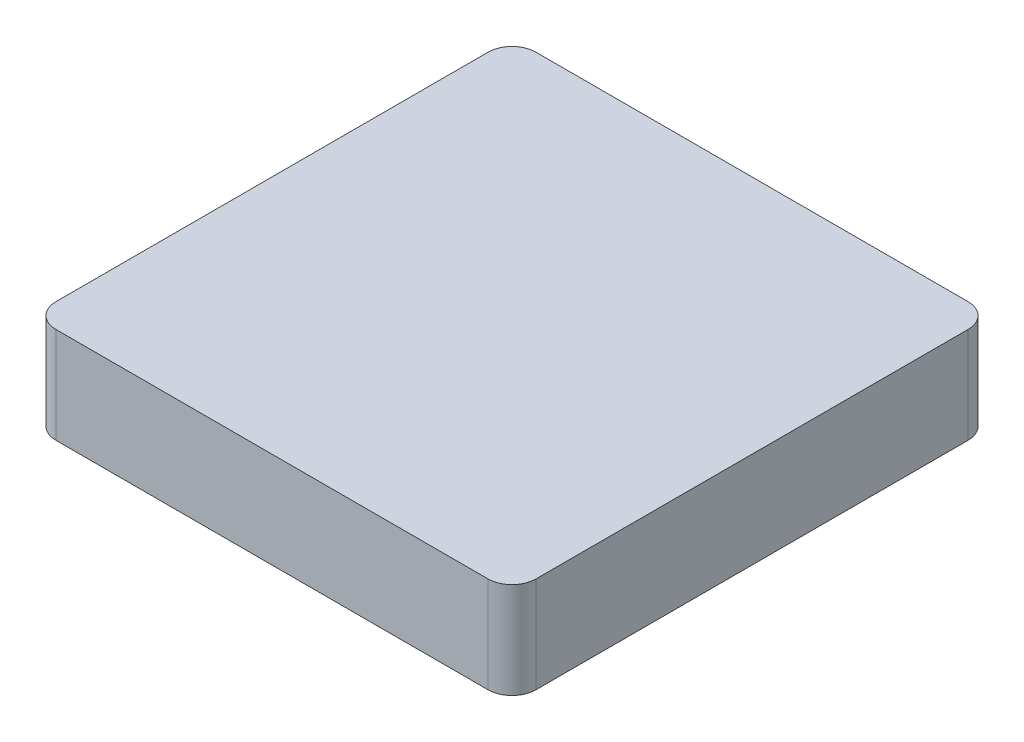
ISO-10303-21;
HEADER;
FILE_DESCRIPTION(('STEP AP214'),'2;1');
FILE_NAME('part.step','',(''),(''),'','','');
FILE_SCHEMA(('AUTOMOTIVE_DESIGN { 1 0 10303 214 1 1 1 1 }'));
ENDSEC;
DATA;
#1=APPLICATION_CONTEXT('core data for automotive mechanical design processes');
#2=APPLICATION_PROTOCOL_DEFINITION('international standard','automotive_design',2000,#1);
#3=PRODUCT_CONTEXT('',#1,'mechanical');
#4=PRODUCT('Part','Part','',(#3));
#5=PRODUCT_RELATED_PRODUCT_CATEGORY('part','',(#4));
#6=PRODUCT_DEFINITION_FORMATION('','',#4);
#7=PRODUCT_DEFINITION_CONTEXT('part definition',#1,'design');
#8=PRODUCT_DEFINITION('design','',#6,#7);
#9=PRODUCT_DEFINITION_SHAPE('','',#8);
#10=(LENGTH_UNIT() NAMED_UNIT(*) SI_UNIT(.MILLI.,.METRE.));
#11=(NAMED_UNIT(*) PLANE_ANGLE_UNIT() SI_UNIT($,.RADIAN.));
#12=(NAMED_UNIT(*) SI_UNIT($,.STERADIAN.) SOLID_ANGLE_UNIT());
#13=UNCERTAINTY_MEASURE_WITH_UNIT(LENGTH_MEASURE(1.E-05),#10,'distance_accuracy_value','');
#14=(GEOMETRIC_REPRESENTATION_CONTEXT(3) GLOBAL_UNCERTAINTY_ASSIGNED_CONTEXT((#13)) GLOBAL_UNIT_ASSIGNED_CONTEXT((#10,
#11,#12)) REPRESENTATION_CONTEXT('',''));
#15=CARTESIAN_POINT('',(0.,0.,0.));
#16=DIRECTION('',(0.,0.,1.));
#17=DIRECTION('',(1.,0.,0.));
#18=AXIS2_PLACEMENT_3D('',#15,#16,#17);
#19=CARTESIAN_POINT('',(0.,2.54,-12.7));
#20=DIRECTION('',(1.,0.,0.));
#21=DIRECTION('',(0.,0.,-1.));
#22=AXIS2_PLACEMENT_3D('',#19,#20,#21);
#23=PLANE('',#22);
#24=DIRECTION('',(0.,0.,1.));
#25=VECTOR('',#24,1.);
#26=CARTESIAN_POINT('',(0.,2.54,-12.7));
#27=LINE('',#26,#25);
#28=CARTESIAN_POINT('',(0.,2.54,-12.065));
#29=VERTEX_POINT('',#28);
#30=CARTESIAN_POINT('',(0.,2.54,-0.635));
#31=VERTEX_POINT('',#30);
#32=EDGE_CURVE('E173',#29,#31,#27,.T.);
#33=ORIENTED_EDGE('',*,*,#32,.F.);
#34=DIRECTION('',(0.,-1.,0.));
#35=VECTOR('',#34,1.);
#36=CARTESIAN_POINT('',(0.,2.54,-12.065));
#37=LINE('',#36,#35);
#38=CARTESIAN_POINT('',(0.,0.,-12.065));
#39=VERTEX_POINT('',#38);
#40=EDGE_CURVE('E198',#29,#39,#37,.T.);
#41=ORIENTED_EDGE('',*,*,#40,.T.);
#42=DIRECTION('',(0.,0.,1.));
#43=VECTOR('',#42,1.);
#44=CARTESIAN_POINT('',(0.,0.,-12.7));
#45=LINE('',#44,#43);
#46=CARTESIAN_POINT('',(0.,0.,-0.635));
#47=VERTEX_POINT('',#46);
#48=EDGE_CURVE('E186',#39,#47,#45,.T.);
#49=ORIENTED_EDGE('',*,*,#48,.T.);
#50=DIRECTION('',(0.,-1.,0.));
#51=VECTOR('',#50,1.);
#52=CARTESIAN_POINT('',(0.,2.54,-0.635));
#53=LINE('',#52,#51);
#54=EDGE_CURVE('E185',#47,#31,#53,.F.);
#55=ORIENTED_EDGE('',*,*,#54,.T.);
#56=EDGE_LOOP('',(#33,#41,#49,#55));
#57=FACE_BOUND('',#56,.T.);
#58=ADVANCED_FACE('F44',(#57),#23,.F.);
#59=CARTESIAN_POINT('',(0.,2.54,0.));
#60=DIRECTION('',(0.,0.,-1.));
#61=DIRECTION('',(-1.,0.,0.));
#62=AXIS2_PLACEMENT_3D('',#59,#60,#61);
#63=PLANE('',#62);
#64=DIRECTION('',(1.,0.,0.));
#65=VECTOR('',#64,1.);
#66=CARTESIAN_POINT('',(0.,0.,0.));
#67=LINE('',#66,#65);
#68=CARTESIAN_POINT('',(0.635,0.,0.));
#69=VERTEX_POINT('',#68);
#70=CARTESIAN_POINT('',(12.065,0.,0.));
#71=VERTEX_POINT('',#70);
#72=EDGE_CURVE('E189',#69,#71,#67,.T.);
#73=ORIENTED_EDGE('',*,*,#72,.T.);
#74=DIRECTION('',(0.,-1.,0.));
#75=VECTOR('',#74,1.);
#76=CARTESIAN_POINT('',(12.065,2.54,0.));
#77=LINE('',#76,#75);
#78=CARTESIAN_POINT('',(12.065,2.54,0.));
#79=VERTEX_POINT('',#78);
#80=EDGE_CURVE('E52',#71,#79,#77,.F.);
#81=ORIENTED_EDGE('',*,*,#80,.T.);
#82=DIRECTION('',(1.,0.,0.));
#83=VECTOR('',#82,1.);
#84=CARTESIAN_POINT('',(0.,2.54,0.));
#85=LINE('',#84,#83);
#86=CARTESIAN_POINT('',(0.635,2.54,0.));
#87=VERTEX_POINT('',#86);
#88=EDGE_CURVE('E176',#87,#79,#85,.T.);
#89=ORIENTED_EDGE('',*,*,#88,.F.);
#90=DIRECTION('',(0.,-1.,0.));
#91=VECTOR('',#90,1.);
#92=CARTESIAN_POINT('',(0.635,2.54,0.));
#93=LINE('',#92,#91);
#94=EDGE_CURVE('E226',#87,#69,#93,.T.);
#95=ORIENTED_EDGE('',*,*,#94,.T.);
#96=EDGE_LOOP('',(#73,#81,#89,#95));
#97=FACE_BOUND('',#96,.T.);
#98=ADVANCED_FACE('F231',(#97),#63,.F.);
#99=CARTESIAN_POINT('',(12.7,2.54,0.));
#100=DIRECTION('',(-1.,0.,0.));
#101=DIRECTION('',(0.,0.,1.));
#102=AXIS2_PLACEMENT_3D('',#99,#100,#101);
#103=PLANE('',#102);
#104=DIRECTION('',(0.,0.,-1.));
#105=VECTOR('',#104,1.);
#106=CARTESIAN_POINT('',(12.7,0.,0.));
#107=LINE('',#106,#105);
#108=CARTESIAN_POINT('',(12.7,0.,-0.635));
#109=VERTEX_POINT('',#108);
#110=CARTESIAN_POINT('',(12.7,0.,-12.065));
#111=VERTEX_POINT('',#110);
#112=EDGE_CURVE('E193',#109,#111,#107,.T.);
#113=ORIENTED_EDGE('',*,*,#112,.T.);
#114=DIRECTION('',(0.,-1.,0.));
#115=VECTOR('',#114,1.);
#116=CARTESIAN_POINT('',(12.7,2.54,-12.065));
#117=LINE('',#116,#115);
#118=CARTESIAN_POINT('',(12.7,2.54,-12.065));
#119=VERTEX_POINT('',#118);
#120=EDGE_CURVE('E67',#111,#119,#117,.F.);
#121=ORIENTED_EDGE('',*,*,#120,.T.);
#122=DIRECTION('',(0.,0.,-1.));
#123=VECTOR('',#122,1.);
#124=CARTESIAN_POINT('',(12.7,2.54,0.));
#125=LINE('',#124,#123);
#126=CARTESIAN_POINT('',(12.7,2.54,-0.635));
#127=VERTEX_POINT('',#126);
#128=EDGE_CURVE('E180',#127,#119,#125,.T.);
#129=ORIENTED_EDGE('',*,*,#128,.F.);
#130=DIRECTION('',(0.,-1.,0.));
#131=VECTOR('',#130,1.);
#132=CARTESIAN_POINT('',(12.7,2.54,-0.635));
#133=LINE('',#132,#131);
#134=EDGE_CURVE('E222',#127,#109,#133,.T.);
#135=ORIENTED_EDGE('',*,*,#134,.T.);
#136=EDGE_LOOP('',(#113,#121,#129,#135));
#137=FACE_BOUND('',#136,.T.);
#138=ADVANCED_FACE('F242',(#137),#103,.F.);
#139=CARTESIAN_POINT('',(12.7,2.54,-12.7));
#140=DIRECTION('',(0.,0.,1.));
#141=DIRECTION('',(1.,0.,0.));
#142=AXIS2_PLACEMENT_3D('',#139,#140,#141);
#143=PLANE('',#142);
#144=DIRECTION('',(-1.,0.,0.));
#145=VECTOR('',#144,1.);
#146=CARTESIAN_POINT('',(12.7,0.,-12.7));
#147=LINE('',#146,#145);
#148=CARTESIAN_POINT('',(12.065,0.,-12.7));
#149=VERTEX_POINT('',#148);
#150=CARTESIAN_POINT('',(0.634999999999995,0.,-12.7));
#151=VERTEX_POINT('',#150);
#152=EDGE_CURVE('E177',#149,#151,#147,.T.);
#153=ORIENTED_EDGE('',*,*,#152,.T.);
#154=DIRECTION('',(0.,-1.,0.));
#155=VECTOR('',#154,1.);
#156=CARTESIAN_POINT('',(0.634999999999995,2.54,-12.7));
#157=LINE('',#156,#155);
#158=CARTESIAN_POINT('',(0.634999999999995,2.54,-12.7));
#159=VERTEX_POINT('',#158);
#160=EDGE_CURVE('E212',#151,#159,#157,.F.);
#161=ORIENTED_EDGE('',*,*,#160,.T.);
#162=DIRECTION('',(-1.,0.,0.));
#163=VECTOR('',#162,1.);
#164=CARTESIAN_POINT('',(12.7,2.54,-12.7));
#165=LINE('',#164,#163);
#166=CARTESIAN_POINT('',(12.065,2.54,-12.7));
#167=VERTEX_POINT('',#166);
#168=EDGE_CURVE('E182',#167,#159,#165,.T.);
#169=ORIENTED_EDGE('',*,*,#168,.F.);
#170=DIRECTION('',(0.,-1.,0.));
#171=VECTOR('',#170,1.);
#172=CARTESIAN_POINT('',(12.065,2.54,-12.7));
#173=LINE('',#172,#171);
#174=EDGE_CURVE('E209',#167,#149,#173,.T.);
#175=ORIENTED_EDGE('',*,*,#174,.T.);
#176=EDGE_LOOP('',(#153,#161,#169,#175));
#177=FACE_BOUND('',#176,.T.);
#178=ADVANCED_FACE('F253',(#177),#143,.F.);
#179=CARTESIAN_POINT('',(0.,2.54,0.));
#180=DIRECTION('',(0.,1.,0.));
#181=DIRECTION('',(0.,0.,1.));
#182=AXIS2_PLACEMENT_3D('',#179,#180,#181);
#183=PLANE('',#182);
#184=ORIENTED_EDGE('',*,*,#168,.T.);
#185=CARTESIAN_POINT('',(0.634999999999995,2.54,-12.065));
#186=DIRECTION('',(0.,1.,0.));
#187=DIRECTION('',(0.,0.,1.));
#188=AXIS2_PLACEMENT_3D('',#185,#186,#187);
#189=CIRCLE('',#188,0.635);
#190=EDGE_CURVE('E220',#159,#29,#189,.T.);
#191=ORIENTED_EDGE('',*,*,#190,.T.);
#192=ORIENTED_EDGE('',*,*,#32,.T.);
#193=CARTESIAN_POINT('',(0.635,2.54,-0.635));
#194=DIRECTION('',(0.,1.,0.));
#195=DIRECTION('',(0.,0.,1.));
#196=AXIS2_PLACEMENT_3D('',#193,#194,#195);
#197=CIRCLE('',#196,0.635);
#198=EDGE_CURVE('E214',#31,#87,#197,.T.);
#199=ORIENTED_EDGE('',*,*,#198,.T.);
#200=ORIENTED_EDGE('',*,*,#88,.T.);
#201=CARTESIAN_POINT('',(12.065,2.54,-0.635));
#202=DIRECTION('',(0.,1.,0.));
#203=DIRECTION('',(0.,0.,1.));
#204=AXIS2_PLACEMENT_3D('',#201,#202,#203);
#205=CIRCLE('',#204,0.635);
#206=EDGE_CURVE('E216',#79,#127,#205,.T.);
#207=ORIENTED_EDGE('',*,*,#206,.T.);
#208=ORIENTED_EDGE('',*,*,#128,.T.);
#209=CARTESIAN_POINT('',(12.065,2.54,-12.065));
#210=DIRECTION('',(0.,1.,0.));
#211=DIRECTION('',(0.,0.,1.));
#212=AXIS2_PLACEMENT_3D('',#209,#210,#211);
#213=CIRCLE('',#212,0.635);
#214=EDGE_CURVE('E218',#119,#167,#213,.T.);
#215=ORIENTED_EDGE('',*,*,#214,.T.);
#216=EDGE_LOOP('',(#184,#191,#192,#199,#200,#207,#208,#215));
#217=FACE_BOUND('',#216,.T.);
#218=ADVANCED_FACE('F237',(#217),#183,.T.);
#219=CARTESIAN_POINT('',(0.,0.,0.));
#220=DIRECTION('',(0.,1.,0.));
#221=DIRECTION('',(0.,0.,1.));
#222=AXIS2_PLACEMENT_3D('',#219,#220,#221);
#223=PLANE('',#222);
#224=DIRECTION('',(-1.,0.,0.));
#225=VECTOR('',#224,1.);
#226=CARTESIAN_POINT('',(12.7,0.,-12.065));
#227=LINE('',#226,#225);
#228=CARTESIAN_POINT('',(12.065,0.,-12.065));
#229=VERTEX_POINT('',#228);
#230=CARTESIAN_POINT('',(0.634999999999995,0.,-12.065));
#231=VERTEX_POINT('',#230);
#232=EDGE_CURVE('E145',#229,#231,#227,.T.);
#233=ORIENTED_EDGE('',*,*,#232,.T.);
#234=DIRECTION('',(0.,0.,1.));
#235=VECTOR('',#234,1.);
#236=CARTESIAN_POINT('',(0.634999999999995,0.,-12.7));
#237=LINE('',#236,#235);
#238=CARTESIAN_POINT('',(0.635,0.,-0.635));
#239=VERTEX_POINT('',#238);
#240=EDGE_CURVE('E151',#231,#239,#237,.T.);
#241=ORIENTED_EDGE('',*,*,#240,.T.);
#242=DIRECTION('',(1.,0.,0.));
#243=VECTOR('',#242,1.);
#244=CARTESIAN_POINT('',(0.,0.,-0.635));
#245=LINE('',#244,#243);
#246=CARTESIAN_POINT('',(12.065,0.,-0.635));
#247=VERTEX_POINT('',#246);
#248=EDGE_CURVE('E167',#239,#247,#245,.T.);
#249=ORIENTED_EDGE('',*,*,#248,.T.);
#250=DIRECTION('',(0.,0.,-1.));
#251=VECTOR('',#250,1.);
#252=CARTESIAN_POINT('',(12.065,0.,0.));
#253=LINE('',#252,#251);
#254=EDGE_CURVE('E59',#247,#229,#253,.T.);
#255=ORIENTED_EDGE('',*,*,#254,.T.);
#256=EDGE_LOOP('',(#233,#241,#249,#255));
#257=FACE_BOUND('',#256,.T.);
#258=ORIENTED_EDGE('',*,*,#48,.F.);
#259=CARTESIAN_POINT('',(0.634999999999995,0.,-12.065));
#260=DIRECTION('',(0.,1.,0.));
#261=DIRECTION('',(0.,0.,1.));
#262=AXIS2_PLACEMENT_3D('',#259,#260,#261);
#263=CIRCLE('',#262,0.635);
#264=EDGE_CURVE('E207',#39,#151,#263,.F.);
#265=ORIENTED_EDGE('',*,*,#264,.T.);
#266=ORIENTED_EDGE('',*,*,#152,.F.);
#267=CARTESIAN_POINT('',(12.065,0.,-12.065));
#268=DIRECTION('',(0.,1.,0.));
#269=DIRECTION('',(0.,0.,1.));
#270=AXIS2_PLACEMENT_3D('',#267,#268,#269);
#271=CIRCLE('',#270,0.635);
#272=EDGE_CURVE('E205',#149,#111,#271,.F.);
#273=ORIENTED_EDGE('',*,*,#272,.T.);
#274=ORIENTED_EDGE('',*,*,#112,.F.);
#275=CARTESIAN_POINT('',(12.065,0.,-0.635));
#276=DIRECTION('',(0.,1.,0.));
#277=DIRECTION('',(0.,0.,1.));
#278=AXIS2_PLACEMENT_3D('',#275,#276,#277);
#279=CIRCLE('',#278,0.635);
#280=EDGE_CURVE('E203',#109,#71,#279,.F.);
#281=ORIENTED_EDGE('',*,*,#280,.T.);
#282=ORIENTED_EDGE('',*,*,#72,.F.);
#283=CARTESIAN_POINT('',(0.635,0.,-0.635));
#284=DIRECTION('',(0.,1.,0.));
#285=DIRECTION('',(0.,0.,1.));
#286=AXIS2_PLACEMENT_3D('',#283,#284,#285);
#287=CIRCLE('',#286,0.635);
#288=EDGE_CURVE('E201',#69,#47,#287,.F.);
#289=ORIENTED_EDGE('',*,*,#288,.T.);
#290=EDGE_LOOP('',(#258,#265,#266,#273,#274,#281,#282,#289));
#291=FACE_BOUND('',#290,.T.);
#292=ADVANCED_FACE('F245',(#257,#291),#223,.F.);
#293=CARTESIAN_POINT('',(0.634999999999995,2.54,-12.065));
#294=DIRECTION('',(0.,-1.,0.));
#295=DIRECTION('',(0.,0.,-1.));
#296=AXIS2_PLACEMENT_3D('',#293,#294,#295);
#297=CYLINDRICAL_SURFACE('',#296,0.635);
#298=ORIENTED_EDGE('',*,*,#190,.F.);
#299=ORIENTED_EDGE('',*,*,#160,.F.);
#300=ORIENTED_EDGE('',*,*,#264,.F.);
#301=ORIENTED_EDGE('',*,*,#40,.F.);
#302=EDGE_LOOP('',(#298,#299,#300,#301));
#303=FACE_BOUND('',#302,.T.);
#304=ADVANCED_FACE('F259',(#303),#297,.T.);
#305=CARTESIAN_POINT('',(12.065,2.54,-12.065));
#306=DIRECTION('',(0.,-1.,0.));
#307=DIRECTION('',(0.,0.,-1.));
#308=AXIS2_PLACEMENT_3D('',#305,#306,#307);
#309=CYLINDRICAL_SURFACE('',#308,0.635);
#310=ORIENTED_EDGE('',*,*,#214,.F.);
#311=ORIENTED_EDGE('',*,*,#120,.F.);
#312=ORIENTED_EDGE('',*,*,#272,.F.);
#313=ORIENTED_EDGE('',*,*,#174,.F.);
#314=EDGE_LOOP('',(#310,#311,#312,#313));
#315=FACE_BOUND('',#314,.T.);
#316=ADVANCED_FACE('F250',(#315),#309,.T.);
#317=CARTESIAN_POINT('',(12.065,2.54,-0.635));
#318=DIRECTION('',(0.,-1.,0.));
#319=DIRECTION('',(0.,0.,-1.));
#320=AXIS2_PLACEMENT_3D('',#317,#318,#319);
#321=CYLINDRICAL_SURFACE('',#320,0.635);
#322=ORIENTED_EDGE('',*,*,#206,.F.);
#323=ORIENTED_EDGE('',*,*,#80,.F.);
#324=ORIENTED_EDGE('',*,*,#280,.F.);
#325=ORIENTED_EDGE('',*,*,#134,.F.);
#326=EDGE_LOOP('',(#322,#323,#324,#325));
#327=FACE_BOUND('',#326,.T.);
#328=ADVANCED_FACE('F240',(#327),#321,.T.);
#329=CARTESIAN_POINT('',(0.635,2.54,-0.635));
#330=DIRECTION('',(0.,-1.,0.));
#331=DIRECTION('',(0.,0.,-1.));
#332=AXIS2_PLACEMENT_3D('',#329,#330,#331);
#333=CYLINDRICAL_SURFACE('',#332,0.635);
#334=ORIENTED_EDGE('',*,*,#198,.F.);
#335=ORIENTED_EDGE('',*,*,#54,.F.);
#336=ORIENTED_EDGE('',*,*,#288,.F.);
#337=ORIENTED_EDGE('',*,*,#94,.F.);
#338=EDGE_LOOP('',(#334,#335,#336,#337));
#339=FACE_BOUND('',#338,.T.);
#340=ADVANCED_FACE('F46',(#339),#333,.T.);
#341=CARTESIAN_POINT('',(0.634999999999995,2.54,-12.7));
#342=DIRECTION('',(1.,0.,0.));
#343=DIRECTION('',(0.,0.,-1.));
#344=AXIS2_PLACEMENT_3D('',#341,#342,#343);
#345=PLANE('',#344);
#346=DIRECTION('',(0.,0.,1.));
#347=VECTOR('',#346,1.);
#348=CARTESIAN_POINT('',(0.634999999999995,1.905,-12.7));
#349=LINE('',#348,#347);
#350=CARTESIAN_POINT('',(0.634999999999995,1.905,-12.065));
#351=VERTEX_POINT('',#350);
#352=CARTESIAN_POINT('',(0.635,1.905,-0.635));
#353=VERTEX_POINT('',#352);
#354=EDGE_CURVE('E135',#351,#353,#349,.T.);
#355=ORIENTED_EDGE('',*,*,#354,.T.);
#356=DIRECTION('',(0.,1.,0.));
#357=VECTOR('',#356,1.);
#358=CARTESIAN_POINT('',(0.635,2.54,-0.635));
#359=LINE('',#358,#357);
#360=EDGE_CURVE('E156',#239,#353,#359,.T.);
#361=ORIENTED_EDGE('',*,*,#360,.F.);
#362=ORIENTED_EDGE('',*,*,#240,.F.);
#363=DIRECTION('',(0.,1.,0.));
#364=VECTOR('',#363,1.);
#365=CARTESIAN_POINT('',(0.634999999999995,2.54,-12.065));
#366=LINE('',#365,#364);
#367=EDGE_CURVE('E148',#231,#351,#366,.T.);
#368=ORIENTED_EDGE('',*,*,#367,.T.);
#369=EDGE_LOOP('',(#355,#361,#362,#368));
#370=FACE_BOUND('',#369,.T.);
#371=ADVANCED_FACE('F149',(#370),#345,.T.);
#372=CARTESIAN_POINT('',(0.,2.54,-0.635));
#373=DIRECTION('',(0.,0.,-1.));
#374=DIRECTION('',(-1.,0.,0.));
#375=AXIS2_PLACEMENT_3D('',#372,#373,#374);
#376=PLANE('',#375);
#377=ORIENTED_EDGE('',*,*,#248,.F.);
#378=ORIENTED_EDGE('',*,*,#360,.T.);
#379=DIRECTION('',(1.,0.,0.));
#380=VECTOR('',#379,1.);
#381=CARTESIAN_POINT('',(0.,1.905,-0.635));
#382=LINE('',#381,#380);
#383=CARTESIAN_POINT('',(12.065,1.905,-0.635));
#384=VERTEX_POINT('',#383);
#385=EDGE_CURVE('E142',#353,#384,#382,.T.);
#386=ORIENTED_EDGE('',*,*,#385,.T.);
#387=DIRECTION('',(0.,1.,0.));
#388=VECTOR('',#387,1.);
#389=CARTESIAN_POINT('',(12.065,2.54,-0.635));
#390=LINE('',#389,#388);
#391=EDGE_CURVE('E190',#247,#384,#390,.T.);
#392=ORIENTED_EDGE('',*,*,#391,.F.);
#393=EDGE_LOOP('',(#377,#378,#386,#392));
#394=FACE_BOUND('',#393,.T.);
#395=ADVANCED_FACE('F268',(#394),#376,.T.);
#396=CARTESIAN_POINT('',(12.065,2.54,0.));
#397=DIRECTION('',(-1.,0.,0.));
#398=DIRECTION('',(0.,0.,1.));
#399=AXIS2_PLACEMENT_3D('',#396,#397,#398);
#400=PLANE('',#399);
#401=ORIENTED_EDGE('',*,*,#254,.F.);
#402=ORIENTED_EDGE('',*,*,#391,.T.);
#403=DIRECTION('',(0.,0.,-1.));
#404=VECTOR('',#403,1.);
#405=CARTESIAN_POINT('',(12.065,1.905,0.));
#406=LINE('',#405,#404);
#407=CARTESIAN_POINT('',(12.065,1.905,-12.065));
#408=VERTEX_POINT('',#407);
#409=EDGE_CURVE('E160',#384,#408,#406,.T.);
#410=ORIENTED_EDGE('',*,*,#409,.T.);
#411=DIRECTION('',(0.,1.,0.));
#412=VECTOR('',#411,1.);
#413=CARTESIAN_POINT('',(12.065,2.54,-12.065));
#414=LINE('',#413,#412);
#415=EDGE_CURVE('E155',#229,#408,#414,.T.);
#416=ORIENTED_EDGE('',*,*,#415,.F.);
#417=EDGE_LOOP('',(#401,#402,#410,#416));
#418=FACE_BOUND('',#417,.T.);
#419=ADVANCED_FACE('F320',(#418),#400,.T.);
#420=CARTESIAN_POINT('',(12.7,2.54,-12.065));
#421=DIRECTION('',(0.,0.,1.));
#422=DIRECTION('',(1.,0.,0.));
#423=AXIS2_PLACEMENT_3D('',#420,#421,#422);
#424=PLANE('',#423);
#425=ORIENTED_EDGE('',*,*,#232,.F.);
#426=ORIENTED_EDGE('',*,*,#415,.T.);
#427=DIRECTION('',(-1.,0.,0.));
#428=VECTOR('',#427,1.);
#429=CARTESIAN_POINT('',(12.7,1.905,-12.065));
#430=LINE('',#429,#428);
#431=EDGE_CURVE('E139',#408,#351,#430,.T.);
#432=ORIENTED_EDGE('',*,*,#431,.T.);
#433=ORIENTED_EDGE('',*,*,#367,.F.);
#434=EDGE_LOOP('',(#425,#426,#432,#433));
#435=FACE_BOUND('',#434,.T.);
#436=ADVANCED_FACE('F158',(#435),#424,.T.);
#437=CARTESIAN_POINT('',(0.,1.905,0.));
#438=DIRECTION('',(0.,1.,0.));
#439=DIRECTION('',(0.,0.,1.));
#440=AXIS2_PLACEMENT_3D('',#437,#438,#439);
#441=PLANE('',#440);
#442=CARTESIAN_POINT('',(6.34999999999999,1.905,-6.35));
#443=DIRECTION('',(0.,1.,0.));
#444=DIRECTION('',(0.,0.,1.));
#445=AXIS2_PLACEMENT_3D('',#442,#443,#444);
#446=CIRCLE('',#445,2.54);
#447=CARTESIAN_POINT('',(6.34999999999999,1.905,-3.81));
#448=VERTEX_POINT('',#447);
#449=EDGE_CURVE('E13',#448,#448,#446,.F.);
#450=ORIENTED_EDGE('',*,*,#449,.F.);
#451=EDGE_LOOP('',(#450));
#452=FACE_BOUND('',#451,.T.);
#453=ORIENTED_EDGE('',*,*,#431,.F.);
#454=ORIENTED_EDGE('',*,*,#409,.F.);
#455=ORIENTED_EDGE('',*,*,#385,.F.);
#456=ORIENTED_EDGE('',*,*,#354,.F.);
#457=EDGE_LOOP('',(#453,#454,#455,#456));
#458=FACE_BOUND('',#457,.T.);
#459=ADVANCED_FACE('F137',(#452,#458),#441,.F.);
#460=CARTESIAN_POINT('',(6.34999999999999,-7.18420489685532,-6.35));
#461=DIRECTION('',(0.,1.,0.));
#462=DIRECTION('',(0.,0.,1.));
#463=AXIS2_PLACEMENT_3D('',#460,#461,#462);
#464=CYLINDRICAL_SURFACE('',#463,2.54);
#465=CARTESIAN_POINT('',(6.34999999999999,0.,-6.35));
#466=DIRECTION('',(0.,1.,0.));
#467=DIRECTION('',(0.,0.,1.));
#468=AXIS2_PLACEMENT_3D('',#465,#466,#467);
#469=CIRCLE('',#468,2.54);
#470=CARTESIAN_POINT('',(6.34999999999999,0.,-3.81));
#471=VERTEX_POINT('',#470);
#472=EDGE_CURVE('E168',#471,#471,#469,.T.);
#473=CARTESIAN_POINT('',(6.34999999999999,0.,-3.81));
#474=CARTESIAN_POINT('',(6.34999999999999,0.0198437499999991,-3.81));
#475=CARTESIAN_POINT('',(6.34999999999999,0.0396874999999989,-3.81));
#476=CARTESIAN_POINT('',(6.34999999999999,0.079374999999999,-3.81));
#477=CARTESIAN_POINT('',(6.34999999999999,0.0992187499999992,-3.81));
#478=CARTESIAN_POINT('',(6.34999999999999,0.138906249999999,-3.81));
#479=CARTESIAN_POINT('',(6.34999999999999,0.158749999999999,-3.81));
#480=CARTESIAN_POINT('',(6.34999999999999,0.198437499999999,-3.81));
#481=CARTESIAN_POINT('',(6.34999999999999,0.218281249999999,-3.81));
#482=CARTESIAN_POINT('',(6.34999999999999,0.25796875,-3.81));
#483=CARTESIAN_POINT('',(6.34999999999999,0.277812499999999,-3.81));
#484=CARTESIAN_POINT('',(6.34999999999999,0.317499999999999,-3.81));
#485=CARTESIAN_POINT('',(6.34999999999999,0.337343749999999,-3.81));
#486=CARTESIAN_POINT('',(6.34999999999999,0.377031249999999,-3.81));
#487=CARTESIAN_POINT('',(6.34999999999999,0.396874999999999,-3.81));
#488=CARTESIAN_POINT('',(6.34999999999999,0.436562499999999,-3.81));
#489=CARTESIAN_POINT('',(6.34999999999999,0.456406249999999,-3.81));
#490=CARTESIAN_POINT('',(6.34999999999999,0.496093749999999,-3.81));
#491=CARTESIAN_POINT('',(6.34999999999999,0.515937499999999,-3.81));
#492=CARTESIAN_POINT('',(6.34999999999999,0.555624999999999,-3.81));
#493=CARTESIAN_POINT('',(6.34999999999999,0.575468749999999,-3.81));
#494=CARTESIAN_POINT('',(6.34999999999999,0.615156249999999,-3.81));
#495=CARTESIAN_POINT('',(6.34999999999999,0.634999999999999,-3.81));
#496=CARTESIAN_POINT('',(6.34999999999999,0.674687499999998,-3.81));
#497=CARTESIAN_POINT('',(6.34999999999999,0.694531249999998,-3.81));
#498=CARTESIAN_POINT('',(6.34999999999999,0.734218749999998,-3.81));
#499=CARTESIAN_POINT('',(6.34999999999999,0.754062499999998,-3.81));
#500=CARTESIAN_POINT('',(6.34999999999999,0.793749999999998,-3.81));
#501=CARTESIAN_POINT('',(6.34999999999999,0.813593749999999,-3.81));
#502=CARTESIAN_POINT('',(6.34999999999999,0.853281249999999,-3.81));
#503=CARTESIAN_POINT('',(6.34999999999999,0.873124999999999,-3.81));
#504=CARTESIAN_POINT('',(6.34999999999999,0.912812499999999,-3.81));
#505=CARTESIAN_POINT('',(6.34999999999999,0.932656249999999,-3.81));
#506=CARTESIAN_POINT('',(6.34999999999999,0.972343749999998,-3.81));
#507=CARTESIAN_POINT('',(6.34999999999999,0.992187499999998,-3.81));
#508=CARTESIAN_POINT('',(6.34999999999999,1.031875,-3.81));
#509=CARTESIAN_POINT('',(6.34999999999999,1.05171875,-3.81));
#510=CARTESIAN_POINT('',(6.34999999999999,1.09140625,-3.81));
#511=CARTESIAN_POINT('',(6.34999999999999,1.11125,-3.81));
#512=CARTESIAN_POINT('',(6.34999999999999,1.1509375,-3.81));
#513=CARTESIAN_POINT('',(6.34999999999999,1.17078125,-3.81));
#514=CARTESIAN_POINT('',(6.34999999999999,1.21046875,-3.81));
#515=CARTESIAN_POINT('',(6.34999999999999,1.2303125,-3.81));
#516=CARTESIAN_POINT('',(6.34999999999999,1.27,-3.81));
#517=CARTESIAN_POINT('',(6.34999999999999,1.28984375,-3.81));
#518=CARTESIAN_POINT('',(6.34999999999999,1.32953125,-3.81));
#519=CARTESIAN_POINT('',(6.34999999999999,1.349375,-3.81));
#520=CARTESIAN_POINT('',(6.34999999999999,1.3890625,-3.81));
#521=CARTESIAN_POINT('',(6.34999999999999,1.40890625,-3.81));
#522=CARTESIAN_POINT('',(6.34999999999999,1.44859375,-3.81));
#523=CARTESIAN_POINT('',(6.34999999999999,1.4684375,-3.81));
#524=CARTESIAN_POINT('',(6.34999999999999,1.508125,-3.81));
#525=CARTESIAN_POINT('',(6.34999999999999,1.52796875,-3.81));
#526=CARTESIAN_POINT('',(6.34999999999999,1.56765625,-3.81));
#527=CARTESIAN_POINT('',(6.34999999999999,1.5875,-3.81));
#528=CARTESIAN_POINT('',(6.34999999999999,1.6271875,-3.81));
#529=CARTESIAN_POINT('',(6.34999999999999,1.64703125,-3.81));
#530=CARTESIAN_POINT('',(6.34999999999999,1.68671875,-3.81));
#531=CARTESIAN_POINT('',(6.34999999999999,1.7065625,-3.81));
#532=CARTESIAN_POINT('',(6.34999999999999,1.74625,-3.81));
#533=CARTESIAN_POINT('',(6.34999999999999,1.76609375,-3.81));
#534=CARTESIAN_POINT('',(6.34999999999999,1.80578125,-3.81));
#535=CARTESIAN_POINT('',(6.34999999999999,1.825625,-3.81));
#536=CARTESIAN_POINT('',(6.34999999999999,1.8653125,-3.81));
#537=CARTESIAN_POINT('',(6.34999999999999,1.88515625,-3.81));
#538=CARTESIAN_POINT('',(6.34999999999999,1.905,-3.81));
#539=B_SPLINE_CURVE_WITH_KNOTS('',3,(#473,#474,#475,#476,#477,#478,#479,#480,#481,#482,#483,
#484,#485,#486,#487,#488,#489,#490,#491,#492,#493,#494,#495,#496,#497,#498,#499,#500,#501,#502,
#503,#504,#505,#506,#507,#508,#509,#510,#511,#512,#513,#514,#515,#516,#517,#518,#519,#520,#521,
#522,#523,#524,#525,#526,#527,#528,#529,#530,#531,#532,#533,#534,#535,#536,#537,#538),
.UNSPECIFIED.,.F.,.F.,(4,2,2,2,2,2,2,2,2,2,2,2,2,2,2,2,2,2,2,2,2,2,2,2,2,2,2,2,2,2,2,2,4),(0.,
0.0595312499999997,0.1190625,0.17859375,0.238125,0.29765625,0.3571875,0.41671875,0.47625,
0.53578125,0.5953125,0.654843749999999,0.714374999999999,0.773906249999999,0.8334375,0.89296875,
0.952499999999999,1.01203125,1.0715625,1.13109375,1.190625,1.25015625,1.3096875,1.36921875,
1.42875,1.48828125,1.5478125,1.60734375,1.666875,1.72640625,1.7859375,1.84546875,1.905),.UNSPECIFIED.);
#540=EDGE_CURVE('BSEAM346',#471,#448,#539,.T.);
#541=ORIENTED_EDGE('',*,*,#472,.T.);
#542=ORIENTED_EDGE('',*,*,#449,.T.);
#543=ORIENTED_EDGE('',*,*,#540,.T.);
#544=ORIENTED_EDGE('',*,*,#540,.F.);
#545=EDGE_LOOP('',(#541,#543,#542,#544));
#546=FACE_BOUND('',#545,.T.);
#547=ADVANCED_FACE('F346',(#546),#464,.T.);
#548=CARTESIAN_POINT('',(0.,0.,0.));
#549=DIRECTION('',(0.,1.,0.));
#550=DIRECTION('',(0.,0.,1.));
#551=AXIS2_PLACEMENT_3D('',#548,#549,#550);
#552=PLANE('',#551);
#553=ORIENTED_EDGE('',*,*,#472,.F.);
#554=EDGE_LOOP('',(#553));
#555=FACE_BOUND('',#554,.T.);
#556=ADVANCED_FACE('F356',(#555),#552,.F.);
#557=CLOSED_SHELL('',(#58,#98,#138,#178,#218,#292,#304,#316,#328,#340,#371,#395,#419,#436,#459,
#547,#556));
#558=MANIFOLD_SOLID_BREP('B2',#557);
#559=ADVANCED_BREP_SHAPE_REPRESENTATION('',(#18,#558),#14);
#560=SHAPE_DEFINITION_REPRESENTATION(#9,#559);
ENDSEC;
END-ISO-10303-21;
